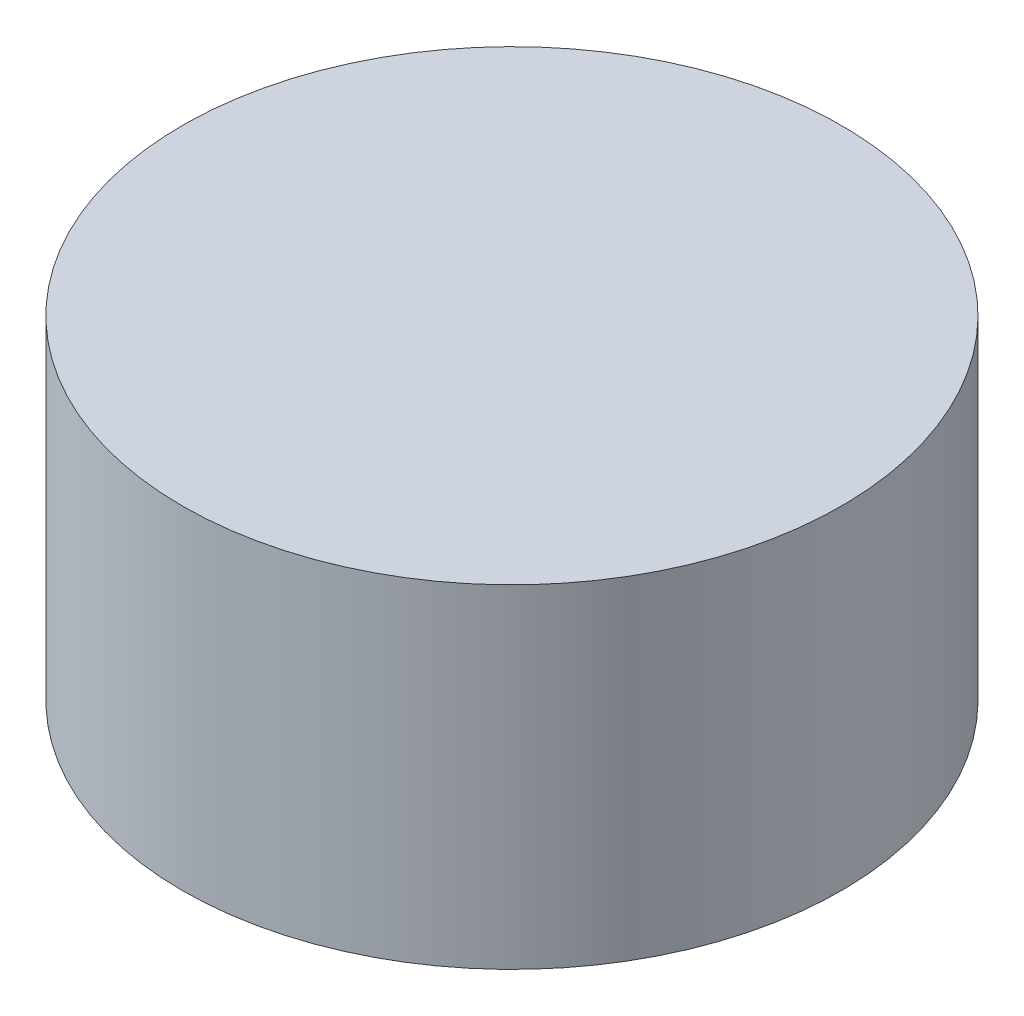
ISO-10303-21;
HEADER;
FILE_DESCRIPTION(('STEP AP214'),'2;1');
FILE_NAME('part.step','',(''),(''),'','','');
FILE_SCHEMA(('AUTOMOTIVE_DESIGN { 1 0 10303 214 1 1 1 1 }'));
ENDSEC;
DATA;
#1=APPLICATION_CONTEXT('core data for automotive mechanical design processes');
#2=APPLICATION_PROTOCOL_DEFINITION('international standard','automotive_design',2000,#1);
#3=PRODUCT_CONTEXT('',#1,'mechanical');
#4=PRODUCT('Part','Part','',(#3));
#5=PRODUCT_RELATED_PRODUCT_CATEGORY('part','',(#4));
#6=PRODUCT_DEFINITION_FORMATION('','',#4);
#7=PRODUCT_DEFINITION_CONTEXT('part definition',#1,'design');
#8=PRODUCT_DEFINITION('design','',#6,#7);
#9=PRODUCT_DEFINITION_SHAPE('','',#8);
#10=(LENGTH_UNIT() NAMED_UNIT(*) SI_UNIT(.MILLI.,.METRE.));
#11=(NAMED_UNIT(*) PLANE_ANGLE_UNIT() SI_UNIT($,.RADIAN.));
#12=(NAMED_UNIT(*) SI_UNIT($,.STERADIAN.) SOLID_ANGLE_UNIT());
#13=UNCERTAINTY_MEASURE_WITH_UNIT(LENGTH_MEASURE(1.E-05),#10,'distance_accuracy_value','');
#14=(GEOMETRIC_REPRESENTATION_CONTEXT(3) GLOBAL_UNCERTAINTY_ASSIGNED_CONTEXT((#13)) GLOBAL_UNIT_ASSIGNED_CONTEXT((#10,
#11,#12)) REPRESENTATION_CONTEXT('',''));
#15=CARTESIAN_POINT('',(0.,0.,0.));
#16=DIRECTION('',(0.,0.,1.));
#17=DIRECTION('',(1.,0.,0.));
#18=AXIS2_PLACEMENT_3D('',#15,#16,#17);
#19=CARTESIAN_POINT('',(-125.,75.,57.));
#20=DIRECTION('',(0.,-1.,0.));
#21=DIRECTION('',(0.,0.,-1.));
#22=AXIS2_PLACEMENT_3D('',#19,#20,#21);
#23=PLANE('',#22);
#24=CARTESIAN_POINT('',(0.,75.,0.0925226692224876));
#25=DIRECTION('',(0.,1.,0.));
#26=DIRECTION('',(0.,0.,1.));
#27=AXIS2_PLACEMENT_3D('',#24,#25,#26);
#28=CIRCLE('',#27,9.89484920947829);
#29=CARTESIAN_POINT('',(0.,75.,9.98737187870078));
#30=VERTEX_POINT('',#29);
#31=EDGE_CURVE('E42',#30,#30,#28,.T.);
#32=ORIENTED_EDGE('',*,*,#31,.T.);
#33=EDGE_LOOP('',(#32));
#34=FACE_BOUND('',#33,.T.);
#35=ADVANCED_FACE('F39',(#34),#23,.F.);
#36=CARTESIAN_POINT('',(0.,65.,0.0925226692224876));
#37=DIRECTION('',(0.,1.,0.));
#38=DIRECTION('',(0.,0.,1.));
#39=AXIS2_PLACEMENT_3D('',#36,#37,#38);
#40=CYLINDRICAL_SURFACE('',#39,9.89484920947829);
#41=CARTESIAN_POINT('',(0.,65.,0.0925226692224876));
#42=DIRECTION('',(0.,1.,0.));
#43=DIRECTION('',(0.,0.,1.));
#44=AXIS2_PLACEMENT_3D('',#41,#42,#43);
#45=CIRCLE('',#44,9.89484920947829);
#46=CARTESIAN_POINT('',(0.,65.,9.98737187870078));
#47=VERTEX_POINT('',#46);
#48=EDGE_CURVE('E10',#47,#47,#45,.T.);
#49=ORIENTED_EDGE('',*,*,#48,.T.);
#50=EDGE_LOOP('',(#49));
#51=FACE_BOUND('',#50,.T.);
#52=ORIENTED_EDGE('',*,*,#31,.F.);
#53=EDGE_LOOP('',(#52));
#54=FACE_BOUND('',#53,.T.);
#55=ADVANCED_FACE('F52',(#51,#54),#40,.T.);
#56=CARTESIAN_POINT('',(0.,65.,0.0925226692224876));
#57=DIRECTION('',(0.,1.,0.));
#58=DIRECTION('',(0.,0.,1.));
#59=AXIS2_PLACEMENT_3D('',#56,#57,#58);
#60=PLANE('',#59);
#61=ORIENTED_EDGE('',*,*,#48,.F.);
#62=EDGE_LOOP('',(#61));
#63=FACE_BOUND('',#62,.T.);
#64=ADVANCED_FACE('F54',(#63),#60,.F.);
#65=CLOSED_SHELL('',(#35,#55,#64));
#66=MANIFOLD_SOLID_BREP('B2',#65);
#67=ADVANCED_BREP_SHAPE_REPRESENTATION('',(#18,#66),#14);
#68=SHAPE_DEFINITION_REPRESENTATION(#9,#67);
ENDSEC;
END-ISO-10303-21;
